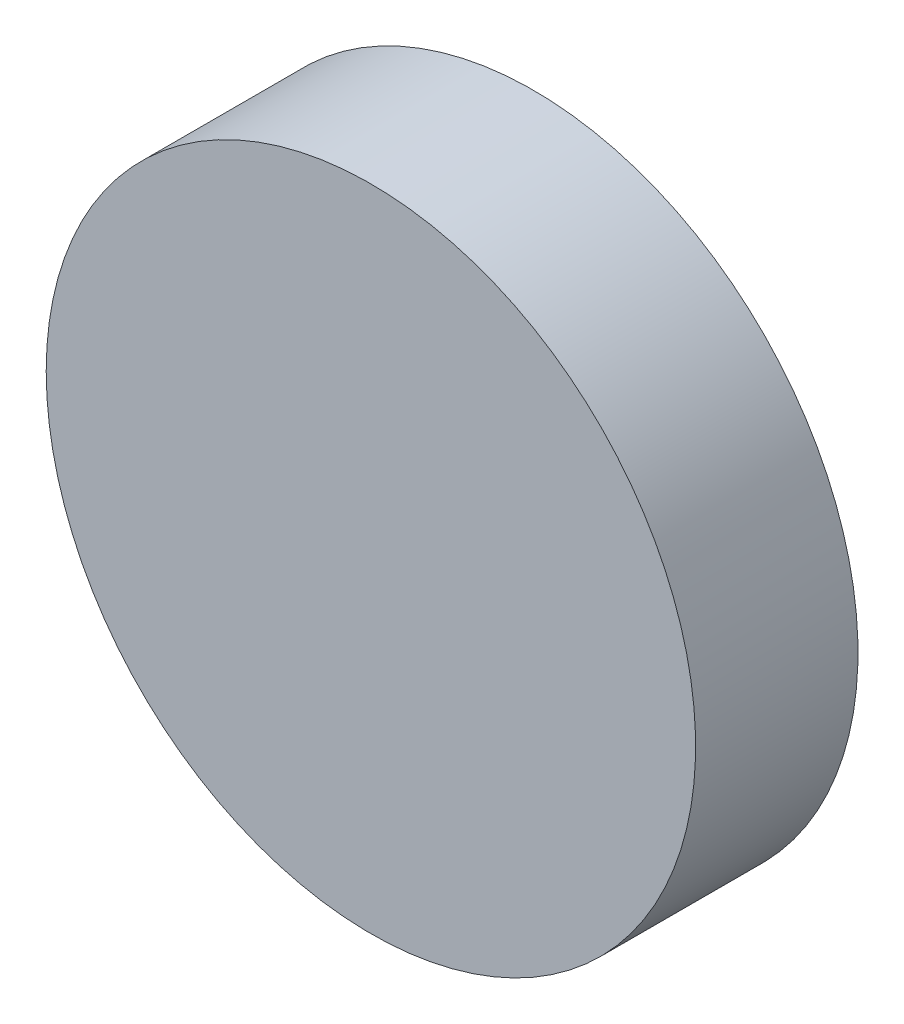
ISO-10303-21;
HEADER;
FILE_DESCRIPTION(('STEP AP214'),'2;1');
FILE_NAME('part.step','',(''),(''),'','','');
FILE_SCHEMA(('AUTOMOTIVE_DESIGN { 1 0 10303 214 1 1 1 1 }'));
ENDSEC;
DATA;
#1=APPLICATION_CONTEXT('core data for automotive mechanical design processes');
#2=APPLICATION_PROTOCOL_DEFINITION('international standard','automotive_design',2000,#1);
#3=PRODUCT_CONTEXT('',#1,'mechanical');
#4=PRODUCT('Part','Part','',(#3));
#5=PRODUCT_RELATED_PRODUCT_CATEGORY('part','',(#4));
#6=PRODUCT_DEFINITION_FORMATION('','',#4);
#7=PRODUCT_DEFINITION_CONTEXT('part definition',#1,'design');
#8=PRODUCT_DEFINITION('design','',#6,#7);
#9=PRODUCT_DEFINITION_SHAPE('','',#8);
#10=(LENGTH_UNIT() NAMED_UNIT(*) SI_UNIT(.MILLI.,.METRE.));
#11=(NAMED_UNIT(*) PLANE_ANGLE_UNIT() SI_UNIT($,.RADIAN.));
#12=(NAMED_UNIT(*) SI_UNIT($,.STERADIAN.) SOLID_ANGLE_UNIT());
#13=UNCERTAINTY_MEASURE_WITH_UNIT(LENGTH_MEASURE(1.E-05),#10,'distance_accuracy_value','');
#14=(GEOMETRIC_REPRESENTATION_CONTEXT(3) GLOBAL_UNCERTAINTY_ASSIGNED_CONTEXT((#13)) GLOBAL_UNIT_ASSIGNED_CONTEXT((#10,
#11,#12)) REPRESENTATION_CONTEXT('',''));
#15=CARTESIAN_POINT('',(0.,0.,0.));
#16=DIRECTION('',(0.,0.,1.));
#17=DIRECTION('',(1.,0.,0.));
#18=AXIS2_PLACEMENT_3D('',#15,#16,#17);
#19=CARTESIAN_POINT('',(0.,0.,26.));
#20=DIRECTION('',(0.,0.,-1.));
#21=DIRECTION('',(-1.,0.,0.));
#22=AXIS2_PLACEMENT_3D('',#19,#20,#21);
#23=CYLINDRICAL_SURFACE('',#22,52.);
#24=CARTESIAN_POINT('',(0.,0.,26.));
#25=DIRECTION('',(0.,0.,1.));
#26=DIRECTION('',(1.,0.,0.));
#27=AXIS2_PLACEMENT_3D('',#24,#25,#26);
#28=CIRCLE('',#27,52.);
#29=CARTESIAN_POINT('',(-52.,0.,26.));
#30=VERTEX_POINT('',#29);
#31=EDGE_CURVE('E10',#30,#30,#28,.T.);
#32=CARTESIAN_POINT('',(0.,0.,0.));
#33=DIRECTION('',(0.,0.,1.));
#34=DIRECTION('',(1.,0.,0.));
#35=AXIS2_PLACEMENT_3D('',#32,#33,#34);
#36=CIRCLE('',#35,52.);
#37=CARTESIAN_POINT('',(-52.,0.,0.));
#38=VERTEX_POINT('',#37);
#39=EDGE_CURVE('E39',#38,#38,#36,.T.);
#40=CARTESIAN_POINT('',(-52.,0.,26.));
#41=CARTESIAN_POINT('',(-52.,0.,25.7291666666667));
#42=CARTESIAN_POINT('',(-52.,0.,25.4583333333333));
#43=CARTESIAN_POINT('',(-52.,0.,24.9166666666667));
#44=CARTESIAN_POINT('',(-52.,0.,24.6458333333333));
#45=CARTESIAN_POINT('',(-52.,0.,24.1041666666667));
#46=CARTESIAN_POINT('',(-52.,0.,23.8333333333333));
#47=CARTESIAN_POINT('',(-52.,0.,23.2916666666667));
#48=CARTESIAN_POINT('',(-52.,0.,23.0208333333333));
#49=CARTESIAN_POINT('',(-52.,0.,22.4791666666667));
#50=CARTESIAN_POINT('',(-52.,0.,22.2083333333333));
#51=CARTESIAN_POINT('',(-52.,0.,21.6666666666667));
#52=CARTESIAN_POINT('',(-52.,0.,21.3958333333333));
#53=CARTESIAN_POINT('',(-52.,0.,20.8541666666667));
#54=CARTESIAN_POINT('',(-52.,0.,20.5833333333333));
#55=CARTESIAN_POINT('',(-52.,0.,20.0416666666667));
#56=CARTESIAN_POINT('',(-52.,0.,19.7708333333333));
#57=CARTESIAN_POINT('',(-52.,0.,19.2291666666667));
#58=CARTESIAN_POINT('',(-52.,0.,18.9583333333333));
#59=CARTESIAN_POINT('',(-52.,0.,18.4166666666667));
#60=CARTESIAN_POINT('',(-52.,0.,18.1458333333333));
#61=CARTESIAN_POINT('',(-52.,0.,17.6041666666667));
#62=CARTESIAN_POINT('',(-52.,0.,17.3333333333333));
#63=CARTESIAN_POINT('',(-52.,0.,16.7916666666667));
#64=CARTESIAN_POINT('',(-52.,0.,16.5208333333333));
#65=CARTESIAN_POINT('',(-52.,0.,15.9791666666667));
#66=CARTESIAN_POINT('',(-52.,0.,15.7083333333333));
#67=CARTESIAN_POINT('',(-52.,0.,15.1666666666667));
#68=CARTESIAN_POINT('',(-52.,0.,14.8958333333333));
#69=CARTESIAN_POINT('',(-52.,0.,14.3541666666667));
#70=CARTESIAN_POINT('',(-52.,0.,14.0833333333333));
#71=CARTESIAN_POINT('',(-52.,0.,13.5416666666667));
#72=CARTESIAN_POINT('',(-52.,0.,13.2708333333333));
#73=CARTESIAN_POINT('',(-52.,0.,12.7291666666667));
#74=CARTESIAN_POINT('',(-52.,0.,12.4583333333333));
#75=CARTESIAN_POINT('',(-52.,0.,11.9166666666667));
#76=CARTESIAN_POINT('',(-52.,0.,11.6458333333333));
#77=CARTESIAN_POINT('',(-52.,0.,11.1041666666667));
#78=CARTESIAN_POINT('',(-52.,0.,10.8333333333333));
#79=CARTESIAN_POINT('',(-52.,0.,10.2916666666667));
#80=CARTESIAN_POINT('',(-52.,0.,10.0208333333333));
#81=CARTESIAN_POINT('',(-52.,0.,9.47916666666667));
#82=CARTESIAN_POINT('',(-52.,0.,9.20833333333333));
#83=CARTESIAN_POINT('',(-52.,0.,8.66666666666667));
#84=CARTESIAN_POINT('',(-52.,0.,8.39583333333333));
#85=CARTESIAN_POINT('',(-52.,0.,7.85416666666667));
#86=CARTESIAN_POINT('',(-52.,0.,7.58333333333333));
#87=CARTESIAN_POINT('',(-52.,0.,7.04166666666667));
#88=CARTESIAN_POINT('',(-52.,0.,6.77083333333333));
#89=CARTESIAN_POINT('',(-52.,0.,6.22916666666667));
#90=CARTESIAN_POINT('',(-52.,0.,5.95833333333333));
#91=CARTESIAN_POINT('',(-52.,0.,5.41666666666667));
#92=CARTESIAN_POINT('',(-52.,0.,5.14583333333333));
#93=CARTESIAN_POINT('',(-52.,0.,4.60416666666667));
#94=CARTESIAN_POINT('',(-52.,0.,4.33333333333333));
#95=CARTESIAN_POINT('',(-52.,0.,3.79166666666667));
#96=CARTESIAN_POINT('',(-52.,0.,3.52083333333333));
#97=CARTESIAN_POINT('',(-52.,0.,2.97916666666667));
#98=CARTESIAN_POINT('',(-52.,0.,2.70833333333333));
#99=CARTESIAN_POINT('',(-52.,0.,2.16666666666667));
#100=CARTESIAN_POINT('',(-52.,0.,1.89583333333333));
#101=CARTESIAN_POINT('',(-52.,0.,1.35416666666667));
#102=CARTESIAN_POINT('',(-52.,0.,1.08333333333333));
#103=CARTESIAN_POINT('',(-52.,0.,0.541666666666667));
#104=CARTESIAN_POINT('',(-52.,0.,0.270833333333334));
#105=CARTESIAN_POINT('',(-52.,0.,0.));
#106=B_SPLINE_CURVE_WITH_KNOTS('',3,(#40,#41,#42,#43,#44,#45,#46,#47,#48,#49,#50,#51,#52,#53,
#54,#55,#56,#57,#58,#59,#60,#61,#62,#63,#64,#65,#66,#67,#68,#69,#70,#71,#72,#73,#74,#75,#76,#77,
#78,#79,#80,#81,#82,#83,#84,#85,#86,#87,#88,#89,#90,#91,#92,#93,#94,#95,#96,#97,#98,#99,#100,
#101,#102,#103,#104,#105),.UNSPECIFIED.,.F.,.F.,(4,2,2,2,2,2,2,2,2,2,2,2,2,2,2,2,2,2,2,2,2,2,2,
2,2,2,2,2,2,2,2,2,4),(0.,0.812500000000001,1.625,2.4375,3.25,4.0625,4.875,5.6875,6.5,7.3125,
8.125,8.9375,9.75,10.5625,11.375,12.1875,13.,13.8125,14.625,15.4375,16.25,17.0625,17.875,
18.6875,19.5,20.3125,21.125,21.9375,22.75,23.5625,24.375,25.1875,26.),.UNSPECIFIED.);
#107=EDGE_CURVE('BSEAM36',#30,#38,#106,.T.);
#108=ORIENTED_EDGE('',*,*,#31,.F.);
#109=ORIENTED_EDGE('',*,*,#39,.T.);
#110=ORIENTED_EDGE('',*,*,#107,.T.);
#111=ORIENTED_EDGE('',*,*,#107,.F.);
#112=EDGE_LOOP('',(#108,#110,#109,#111));
#113=FACE_BOUND('',#112,.T.);
#114=ADVANCED_FACE('F36',(#113),#23,.T.);
#115=CARTESIAN_POINT('',(0.,0.,26.));
#116=DIRECTION('',(0.,0.,1.));
#117=DIRECTION('',(1.,0.,0.));
#118=AXIS2_PLACEMENT_3D('',#115,#116,#117);
#119=PLANE('',#118);
#120=ORIENTED_EDGE('',*,*,#31,.T.);
#121=EDGE_LOOP('',(#120));
#122=FACE_BOUND('',#121,.T.);
#123=ADVANCED_FACE('F51',(#122),#119,.T.);
#124=CARTESIAN_POINT('',(0.,0.,0.));
#125=DIRECTION('',(0.,0.,1.));
#126=DIRECTION('',(1.,0.,0.));
#127=AXIS2_PLACEMENT_3D('',#124,#125,#126);
#128=PLANE('',#127);
#129=ORIENTED_EDGE('',*,*,#39,.F.);
#130=EDGE_LOOP('',(#129));
#131=FACE_BOUND('',#130,.T.);
#132=ADVANCED_FACE('F49',(#131),#128,.F.);
#133=CLOSED_SHELL('',(#114,#123,#132));
#134=MANIFOLD_SOLID_BREP('B2',#133);
#135=ADVANCED_BREP_SHAPE_REPRESENTATION('',(#18,#134),#14);
#136=SHAPE_DEFINITION_REPRESENTATION(#9,#135);
ENDSEC;
END-ISO-10303-21;
